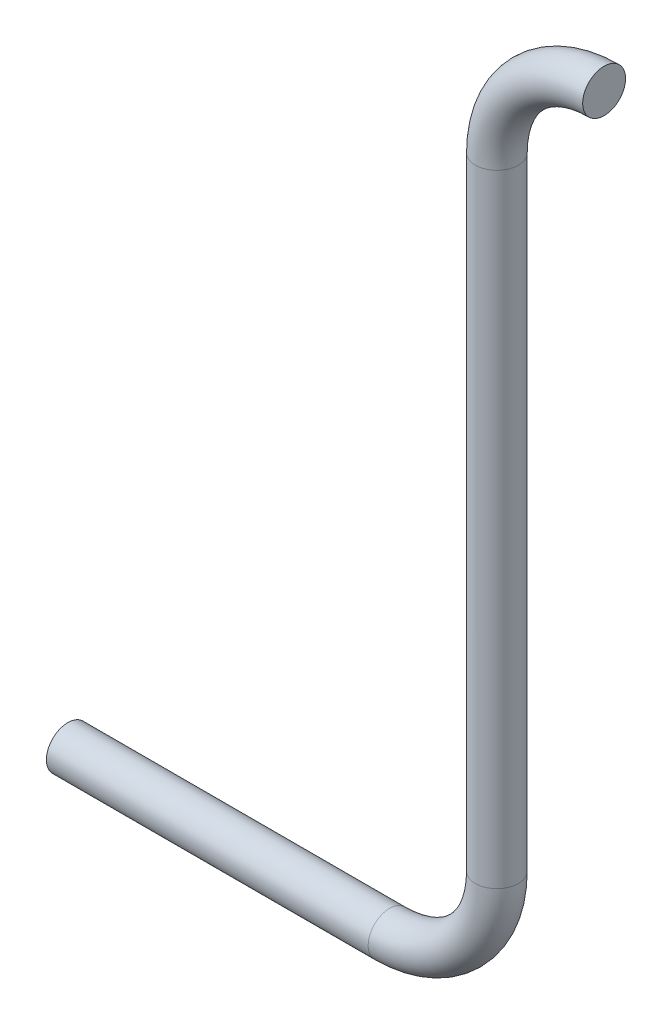
ISO-10303-21;
HEADER;
FILE_DESCRIPTION(('STEP AP214'),'2;1');
FILE_NAME('part.step','',(''),(''),'','','');
FILE_SCHEMA(('AUTOMOTIVE_DESIGN { 1 0 10303 214 1 1 1 1 }'));
ENDSEC;
DATA;
#1=APPLICATION_CONTEXT('core data for automotive mechanical design processes');
#2=APPLICATION_PROTOCOL_DEFINITION('international standard','automotive_design',2000,#1);
#3=PRODUCT_CONTEXT('',#1,'mechanical');
#4=PRODUCT('Part','Part','',(#3));
#5=PRODUCT_RELATED_PRODUCT_CATEGORY('part','',(#4));
#6=PRODUCT_DEFINITION_FORMATION('','',#4);
#7=PRODUCT_DEFINITION_CONTEXT('part definition',#1,'design');
#8=PRODUCT_DEFINITION('design','',#6,#7);
#9=PRODUCT_DEFINITION_SHAPE('','',#8);
#10=(LENGTH_UNIT() NAMED_UNIT(*) SI_UNIT(.MILLI.,.METRE.));
#11=(NAMED_UNIT(*) PLANE_ANGLE_UNIT() SI_UNIT($,.RADIAN.));
#12=(NAMED_UNIT(*) SI_UNIT($,.STERADIAN.) SOLID_ANGLE_UNIT());
#13=UNCERTAINTY_MEASURE_WITH_UNIT(LENGTH_MEASURE(1.E-05),#10,'distance_accuracy_value','');
#14=(GEOMETRIC_REPRESENTATION_CONTEXT(3) GLOBAL_UNCERTAINTY_ASSIGNED_CONTEXT((#13)) GLOBAL_UNIT_ASSIGNED_CONTEXT((#10,
#11,#12)) REPRESENTATION_CONTEXT('',''));
#15=CARTESIAN_POINT('',(0.,0.,0.));
#16=DIRECTION('',(0.,0.,1.));
#17=DIRECTION('',(1.,0.,0.));
#18=AXIS2_PLACEMENT_3D('',#15,#16,#17);
#19=CARTESIAN_POINT('',(0.,0.,0.));
#20=DIRECTION('',(1.,0.,0.));
#21=DIRECTION('',(0.,0.,-1.));
#22=AXIS2_PLACEMENT_3D('',#19,#20,#21);
#23=PLANE('',#22);
#24=CARTESIAN_POINT('',(0.,0.,0.));
#25=DIRECTION('',(1.,0.,0.));
#26=DIRECTION('',(0.,0.,-1.));
#27=AXIS2_PLACEMENT_3D('',#24,#25,#26);
#28=CIRCLE('',#27,1.);
#29=CARTESIAN_POINT('',(0.,0.,-1.));
#30=VERTEX_POINT('',#29);
#31=EDGE_CURVE('E44',#30,#30,#28,.T.);
#32=ORIENTED_EDGE('',*,*,#31,.T.);
#33=EDGE_LOOP('',(#32));
#34=FACE_BOUND('',#33,.T.);
#35=ADVANCED_FACE('F32',(#34),#23,.T.);
#36=CARTESIAN_POINT('',(-25.,-39.,0.));
#37=DIRECTION('',(1.,0.,0.));
#38=DIRECTION('',(0.,0.,-1.));
#39=AXIS2_PLACEMENT_3D('',#36,#37,#38);
#40=PLANE('',#39);
#41=CARTESIAN_POINT('',(-25.,-39.,0.));
#42=DIRECTION('',(1.,0.,0.));
#43=DIRECTION('',(0.,0.,-1.));
#44=AXIS2_PLACEMENT_3D('',#41,#42,#43);
#45=CIRCLE('',#44,1.);
#46=CARTESIAN_POINT('',(-25.,-39.,-1.));
#47=VERTEX_POINT('',#46);
#48=EDGE_CURVE('E11',#47,#47,#45,.T.);
#49=ORIENTED_EDGE('',*,*,#48,.F.);
#50=EDGE_LOOP('',(#49));
#51=FACE_BOUND('',#50,.T.);
#52=ADVANCED_FACE('F50',(#51),#40,.F.);
#53=CARTESIAN_POINT('',(0.,-5.,0.));
#54=DIRECTION('',(0.,0.,1.));
#55=DIRECTION('',(1.,0.,0.));
#56=AXIS2_PLACEMENT_3D('',#53,#54,#55);
#57=TOROIDAL_SURFACE('',#56,5.,1.);
#58=CARTESIAN_POINT('',(-5.,-5.,0.));
#59=DIRECTION('',(0.,1.,0.));
#60=DIRECTION('',(0.,0.,-1.));
#61=AXIS2_PLACEMENT_3D('',#58,#59,#60);
#62=CIRCLE('',#61,1.);
#63=CARTESIAN_POINT('',(-5.,-5.,-1.));
#64=VERTEX_POINT('',#63);
#65=EDGE_CURVE('E80',#64,#64,#62,.T.);
#66=ORIENTED_EDGE('',*,*,#65,.T.);
#67=EDGE_LOOP('',(#66));
#68=FACE_BOUND('',#67,.T.);
#69=ORIENTED_EDGE('',*,*,#31,.F.);
#70=EDGE_LOOP('',(#69));
#71=FACE_BOUND('',#70,.T.);
#72=ADVANCED_FACE('F52',(#68,#71),#57,.T.);
#73=CARTESIAN_POINT('',(-5.,-5.,0.));
#74=DIRECTION('',(0.,-1.,0.));
#75=DIRECTION('',(1.,0.,0.));
#76=AXIS2_PLACEMENT_3D('',#73,#74,#75);
#77=CYLINDRICAL_SURFACE('',#76,1.);
#78=CARTESIAN_POINT('',(-5.,-34.,0.));
#79=DIRECTION('',(0.,1.,0.));
#80=DIRECTION('',(0.,0.,-1.));
#81=AXIS2_PLACEMENT_3D('',#78,#79,#80);
#82=CIRCLE('',#81,1.);
#83=CARTESIAN_POINT('',(-4.,-34.,0.));
#84=VERTEX_POINT('',#83);
#85=EDGE_CURVE('E77',#84,#84,#82,.T.);
#86=ORIENTED_EDGE('',*,*,#85,.T.);
#87=EDGE_LOOP('',(#86));
#88=FACE_BOUND('',#87,.T.);
#89=ORIENTED_EDGE('',*,*,#65,.F.);
#90=EDGE_LOOP('',(#89));
#91=FACE_BOUND('',#90,.T.);
#92=ADVANCED_FACE('F57',(#88,#91),#77,.T.);
#93=CARTESIAN_POINT('',(-10.,-34.,0.));
#94=DIRECTION('',(0.,0.,-1.));
#95=DIRECTION('',(-1.,0.,0.));
#96=AXIS2_PLACEMENT_3D('',#93,#94,#95);
#97=TOROIDAL_SURFACE('',#96,5.,1.);
#98=CARTESIAN_POINT('',(-10.,-39.,0.));
#99=DIRECTION('',(1.,0.,0.));
#100=DIRECTION('',(0.,0.,-1.));
#101=AXIS2_PLACEMENT_3D('',#98,#99,#100);
#102=CIRCLE('',#101,1.);
#103=CARTESIAN_POINT('',(-10.,-40.,0.));
#104=VERTEX_POINT('',#103);
#105=EDGE_CURVE('E39',#104,#104,#102,.T.);
#106=CARTESIAN_POINT('',(-10.,-34.,0.));
#107=DIRECTION('',(0.,0.,-1.));
#108=DIRECTION('',(-1.,0.,0.));
#109=AXIS2_PLACEMENT_3D('',#106,#107,#108);
#110=CIRCLE('',#109,6.);
#111=EDGE_CURVE('',#84,#104,#110,.T.);
#112=ORIENTED_EDGE('',*,*,#85,.F.);
#113=ORIENTED_EDGE('',*,*,#105,.T.);
#114=ORIENTED_EDGE('',*,*,#111,.T.);
#115=ORIENTED_EDGE('',*,*,#111,.F.);
#116=EDGE_LOOP('',(#112,#114,#113,#115));
#117=FACE_BOUND('',#116,.T.);
#118=ADVANCED_FACE('F63',(#117),#97,.T.);
#119=CARTESIAN_POINT('',(-10.,-39.,0.));
#120=DIRECTION('',(-1.,0.,0.));
#121=DIRECTION('',(0.,0.,1.));
#122=AXIS2_PLACEMENT_3D('',#119,#120,#121);
#123=CYLINDRICAL_SURFACE('',#122,1.);
#124=ORIENTED_EDGE('',*,*,#48,.T.);
#125=EDGE_LOOP('',(#124));
#126=FACE_BOUND('',#125,.T.);
#127=ORIENTED_EDGE('',*,*,#105,.F.);
#128=EDGE_LOOP('',(#127));
#129=FACE_BOUND('',#128,.T.);
#130=ADVANCED_FACE('F47',(#126,#129),#123,.T.);
#131=CLOSED_SHELL('',(#35,#52,#72,#92,#118,#130));
#132=MANIFOLD_SOLID_BREP('B2',#131);
#133=ADVANCED_BREP_SHAPE_REPRESENTATION('',(#18,#132),#14);
#134=SHAPE_DEFINITION_REPRESENTATION(#9,#133);
ENDSEC;
END-ISO-10303-21;
